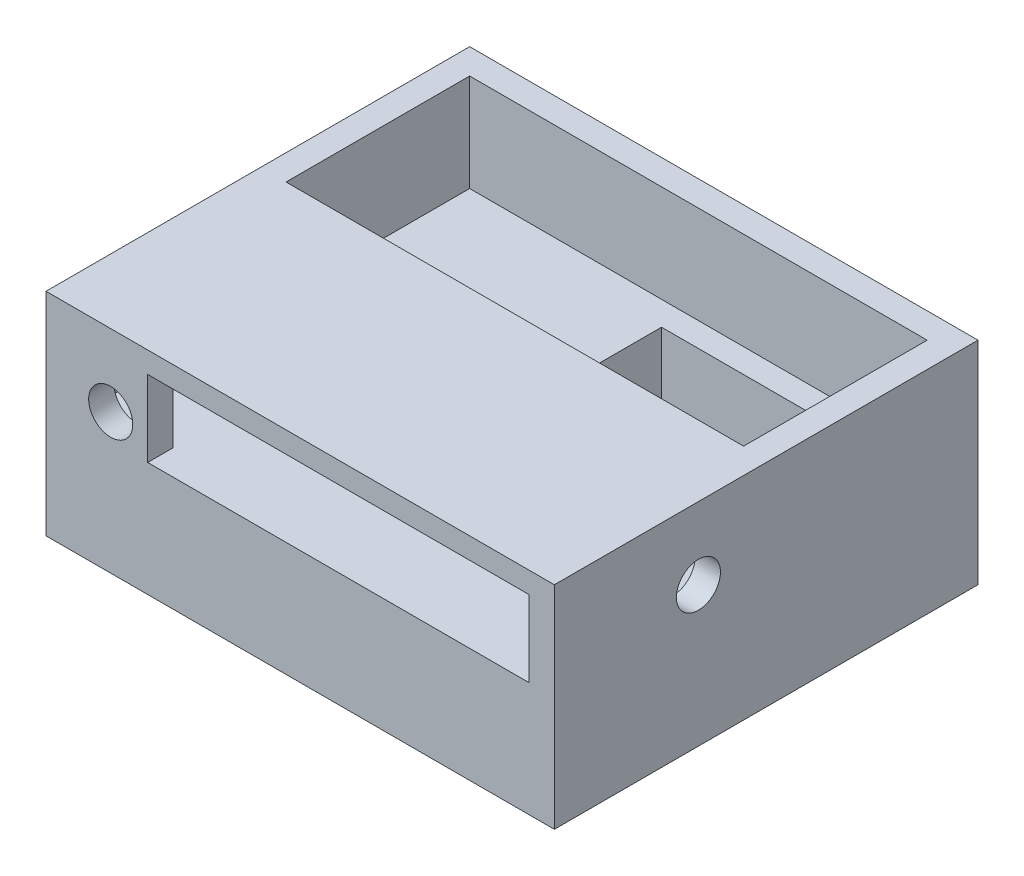
ISO-10303-21;
HEADER;
FILE_DESCRIPTION(('STEP AP214'),'2;1');
FILE_NAME('part.step','',(''),(''),'','','');
FILE_SCHEMA(('AUTOMOTIVE_DESIGN { 1 0 10303 214 1 1 1 1 }'));
ENDSEC;
DATA;
#1=APPLICATION_CONTEXT('core data for automotive mechanical design processes');
#2=APPLICATION_PROTOCOL_DEFINITION('international standard','automotive_design',2000,#1);
#3=PRODUCT_CONTEXT('',#1,'mechanical');
#4=PRODUCT('Part','Part','',(#3));
#5=PRODUCT_RELATED_PRODUCT_CATEGORY('part','',(#4));
#6=PRODUCT_DEFINITION_FORMATION('','',#4);
#7=PRODUCT_DEFINITION_CONTEXT('part definition',#1,'design');
#8=PRODUCT_DEFINITION('design','',#6,#7);
#9=PRODUCT_DEFINITION_SHAPE('','',#8);
#10=(LENGTH_UNIT() NAMED_UNIT(*) SI_UNIT(.MILLI.,.METRE.));
#11=(NAMED_UNIT(*) PLANE_ANGLE_UNIT() SI_UNIT($,.RADIAN.));
#12=(NAMED_UNIT(*) SI_UNIT($,.STERADIAN.) SOLID_ANGLE_UNIT());
#13=UNCERTAINTY_MEASURE_WITH_UNIT(LENGTH_MEASURE(1.E-05),#10,'distance_accuracy_value','');
#14=(GEOMETRIC_REPRESENTATION_CONTEXT(3) GLOBAL_UNCERTAINTY_ASSIGNED_CONTEXT((#13)) GLOBAL_UNIT_ASSIGNED_CONTEXT((#10,
#11,#12)) REPRESENTATION_CONTEXT('',''));
#15=CARTESIAN_POINT('',(0.,0.,0.));
#16=DIRECTION('',(0.,0.,1.));
#17=DIRECTION('',(1.,0.,0.));
#18=AXIS2_PLACEMENT_3D('',#15,#16,#17);
#19=CARTESIAN_POINT('',(0.,0.,0.));
#20=DIRECTION('',(0.,1.,0.));
#21=DIRECTION('',(0.,0.,1.));
#22=AXIS2_PLACEMENT_3D('',#19,#20,#21);
#23=PLANE('',#22);
#24=DIRECTION('',(0.,0.,-1.));
#25=VECTOR('',#24,1.);
#26=CARTESIAN_POINT('',(28.5,0.,5.85000000000001));
#27=LINE('',#26,#25);
#28=CARTESIAN_POINT('',(28.5,0.,18.15));
#29=VERTEX_POINT('',#28);
#30=CARTESIAN_POINT('',(28.5,0.,5.85000000000001));
#31=VERTEX_POINT('',#30);
#32=EDGE_CURVE('E572',#29,#31,#27,.T.);
#33=ORIENTED_EDGE('',*,*,#32,.F.);
#34=DIRECTION('',(-1.,0.,0.));
#35=VECTOR('',#34,1.);
#36=CARTESIAN_POINT('',(56.5,0.,18.15));
#37=LINE('',#36,#35);
#38=CARTESIAN_POINT('',(23.5,0.,18.15));
#39=VERTEX_POINT('',#38);
#40=EDGE_CURVE('E245',#29,#39,#37,.T.);
#41=ORIENTED_EDGE('',*,*,#40,.T.);
#42=DIRECTION('',(0.,0.,-1.));
#43=VECTOR('',#42,1.);
#44=CARTESIAN_POINT('',(23.5,0.,5.85000000000001));
#45=LINE('',#44,#43);
#46=CARTESIAN_POINT('',(23.5,0.,5.85000000000001));
#47=VERTEX_POINT('',#46);
#48=EDGE_CURVE('E257',#39,#47,#45,.T.);
#49=ORIENTED_EDGE('',*,*,#48,.T.);
#50=DIRECTION('',(1.,0.,0.));
#51=VECTOR('',#50,1.);
#52=CARTESIAN_POINT('',(56.5,0.,5.85000000000001));
#53=LINE('',#52,#51);
#54=EDGE_CURVE('E254',#47,#31,#53,.T.);
#55=ORIENTED_EDGE('',*,*,#54,.T.);
#56=EDGE_LOOP('',(#33,#41,#49,#55));
#57=FACE_BOUND('',#56,.T.);
#58=ADVANCED_FACE('F35',(#57),#23,.F.);
#59=CARTESIAN_POINT('',(0.,20.,0.));
#60=DIRECTION('',(1.,0.,0.));
#61=DIRECTION('',(0.,0.,-1.));
#62=AXIS2_PLACEMENT_3D('',#59,#60,#61);
#63=PLANE('',#62);
#64=DIRECTION('',(0.,-1.,0.));
#65=VECTOR('',#64,1.);
#66=CARTESIAN_POINT('',(0.,20.,50.));
#67=LINE('',#66,#65);
#68=CARTESIAN_POINT('',(0.,20.,50.));
#69=VERTEX_POINT('',#68);
#70=CARTESIAN_POINT('',(0.,-5.,50.));
#71=VERTEX_POINT('',#70);
#72=EDGE_CURVE('E233',#69,#71,#67,.T.);
#73=ORIENTED_EDGE('',*,*,#72,.F.);
#74=DIRECTION('',(0.,0.,1.));
#75=VECTOR('',#74,1.);
#76=CARTESIAN_POINT('',(0.,20.,0.));
#77=LINE('',#76,#75);
#78=CARTESIAN_POINT('',(0.,20.,0.));
#79=VERTEX_POINT('',#78);
#80=EDGE_CURVE('E215',#79,#69,#77,.T.);
#81=ORIENTED_EDGE('',*,*,#80,.F.);
#82=DIRECTION('',(0.,-1.,0.));
#83=VECTOR('',#82,1.);
#84=CARTESIAN_POINT('',(0.,20.,0.));
#85=LINE('',#84,#83);
#86=CARTESIAN_POINT('',(0.,-5.,0.));
#87=VERTEX_POINT('',#86);
#88=EDGE_CURVE('E227',#79,#87,#85,.T.);
#89=ORIENTED_EDGE('',*,*,#88,.T.);
#90=DIRECTION('',(0.,0.,-1.));
#91=VECTOR('',#90,1.);
#92=CARTESIAN_POINT('',(0.,-5.,0.));
#93=LINE('',#92,#91);
#94=EDGE_CURVE('E567',#71,#87,#93,.T.);
#95=ORIENTED_EDGE('',*,*,#94,.F.);
#96=EDGE_LOOP('',(#73,#81,#89,#95));
#97=FACE_BOUND('',#96,.T.);
#98=ADVANCED_FACE('F37',(#97),#63,.F.);
#99=CARTESIAN_POINT('',(0.,20.,50.));
#100=DIRECTION('',(0.,0.,-1.));
#101=DIRECTION('',(-1.,0.,0.));
#102=AXIS2_PLACEMENT_3D('',#99,#100,#101);
#103=PLANE('',#102);
#104=DIRECTION('',(-1.,0.,0.));
#105=VECTOR('',#104,1.);
#106=CARTESIAN_POINT('',(57.,17.5,50.));
#107=LINE('',#106,#105);
#108=CARTESIAN_POINT('',(57.,17.5,50.));
#109=VERTEX_POINT('',#108);
#110=CARTESIAN_POINT('',(12.,17.5,50.));
#111=VERTEX_POINT('',#110);
#112=EDGE_CURVE('E289',#109,#111,#107,.T.);
#113=ORIENTED_EDGE('',*,*,#112,.F.);
#114=DIRECTION('',(0.,1.,0.));
#115=VECTOR('',#114,1.);
#116=CARTESIAN_POINT('',(57.,17.5,50.));
#117=LINE('',#116,#115);
#118=CARTESIAN_POINT('',(57.,8.5,50.));
#119=VERTEX_POINT('',#118);
#120=EDGE_CURVE('E291',#119,#109,#117,.T.);
#121=ORIENTED_EDGE('',*,*,#120,.F.);
#122=DIRECTION('',(1.,0.,0.));
#123=VECTOR('',#122,1.);
#124=CARTESIAN_POINT('',(57.,8.5,50.));
#125=LINE('',#124,#123);
#126=CARTESIAN_POINT('',(12.,8.5,50.));
#127=VERTEX_POINT('',#126);
#128=EDGE_CURVE('E189',#127,#119,#125,.T.);
#129=ORIENTED_EDGE('',*,*,#128,.F.);
#130=DIRECTION('',(0.,-1.,0.));
#131=VECTOR('',#130,1.);
#132=CARTESIAN_POINT('',(12.,17.5,50.));
#133=LINE('',#132,#131);
#134=EDGE_CURVE('E173',#111,#127,#133,.T.);
#135=ORIENTED_EDGE('',*,*,#134,.F.);
#136=EDGE_LOOP('',(#113,#121,#129,#135));
#137=FACE_BOUND('',#136,.T.);
#138=CARTESIAN_POINT('',(7.63625123278189,11.4923007266441,50.));
#139=DIRECTION('',(0.,0.,1.));
#140=DIRECTION('',(1.,0.,0.));
#141=AXIS2_PLACEMENT_3D('',#138,#139,#140);
#142=CIRCLE('',#141,2.6);
#143=CARTESIAN_POINT('',(10.2362512327819,11.4923007266441,50.));
#144=VERTEX_POINT('',#143);
#145=EDGE_CURVE('E244',#144,#144,#142,.T.);
#146=ORIENTED_EDGE('',*,*,#145,.F.);
#147=EDGE_LOOP('',(#146));
#148=FACE_BOUND('',#147,.T.);
#149=DIRECTION('',(-1.,0.,0.));
#150=VECTOR('',#149,1.);
#151=CARTESIAN_POINT('',(60.,-5.,50.));
#152=LINE('',#151,#150);
#153=CARTESIAN_POINT('',(60.,-5.,50.));
#154=VERTEX_POINT('',#153);
#155=EDGE_CURVE('E609',#154,#71,#152,.T.);
#156=ORIENTED_EDGE('',*,*,#155,.F.);
#157=DIRECTION('',(0.,-1.,0.));
#158=VECTOR('',#157,1.);
#159=CARTESIAN_POINT('',(60.,20.,50.));
#160=LINE('',#159,#158);
#161=CARTESIAN_POINT('',(60.,20.,50.));
#162=VERTEX_POINT('',#161);
#163=EDGE_CURVE('E231',#162,#154,#160,.T.);
#164=ORIENTED_EDGE('',*,*,#163,.F.);
#165=DIRECTION('',(1.,0.,0.));
#166=VECTOR('',#165,1.);
#167=CARTESIAN_POINT('',(0.,20.,50.));
#168=LINE('',#167,#166);
#169=EDGE_CURVE('E221',#69,#162,#168,.T.);
#170=ORIENTED_EDGE('',*,*,#169,.F.);
#171=ORIENTED_EDGE('',*,*,#72,.T.);
#172=EDGE_LOOP('',(#156,#164,#170,#171));
#173=FACE_BOUND('',#172,.T.);
#174=ADVANCED_FACE('F298',(#137,#148,#173),#103,.F.);
#175=CARTESIAN_POINT('',(60.,20.,0.));
#176=DIRECTION('',(-1.,0.,0.));
#177=DIRECTION('',(0.,0.,1.));
#178=AXIS2_PLACEMENT_3D('',#175,#176,#177);
#179=PLANE('',#178);
#180=CARTESIAN_POINT('',(60.,11.5,33.));
#181=DIRECTION('',(1.,0.,0.));
#182=DIRECTION('',(0.,0.,-1.));
#183=AXIS2_PLACEMENT_3D('',#180,#181,#182);
#184=CIRCLE('',#183,2.6);
#185=CARTESIAN_POINT('',(60.,11.5,30.4));
#186=VERTEX_POINT('',#185);
#187=EDGE_CURVE('E240',#186,#186,#184,.T.);
#188=ORIENTED_EDGE('',*,*,#187,.F.);
#189=EDGE_LOOP('',(#188));
#190=FACE_BOUND('',#189,.T.);
#191=DIRECTION('',(0.,-1.,0.));
#192=VECTOR('',#191,1.);
#193=CARTESIAN_POINT('',(60.,20.,0.));
#194=LINE('',#193,#192);
#195=CARTESIAN_POINT('',(60.,20.,0.));
#196=VERTEX_POINT('',#195);
#197=CARTESIAN_POINT('',(60.,-5.,0.));
#198=VERTEX_POINT('',#197);
#199=EDGE_CURVE('E229',#196,#198,#194,.T.);
#200=ORIENTED_EDGE('',*,*,#199,.F.);
#201=DIRECTION('',(0.,0.,-1.));
#202=VECTOR('',#201,1.);
#203=CARTESIAN_POINT('',(60.,20.,0.));
#204=LINE('',#203,#202);
#205=EDGE_CURVE('E223',#162,#196,#204,.T.);
#206=ORIENTED_EDGE('',*,*,#205,.F.);
#207=ORIENTED_EDGE('',*,*,#163,.T.);
#208=DIRECTION('',(0.,0.,1.));
#209=VECTOR('',#208,1.);
#210=CARTESIAN_POINT('',(60.,-5.,0.));
#211=LINE('',#210,#209);
#212=EDGE_CURVE('E605',#198,#154,#211,.T.);
#213=ORIENTED_EDGE('',*,*,#212,.F.);
#214=EDGE_LOOP('',(#200,#206,#207,#213));
#215=FACE_BOUND('',#214,.T.);
#216=ADVANCED_FACE('F337',(#190,#215),#179,.F.);
#217=CARTESIAN_POINT('',(0.,20.,0.));
#218=DIRECTION('',(0.,0.,1.));
#219=DIRECTION('',(1.,0.,0.));
#220=AXIS2_PLACEMENT_3D('',#217,#218,#219);
#221=PLANE('',#220);
#222=ORIENTED_EDGE('',*,*,#199,.T.);
#223=DIRECTION('',(1.,0.,0.));
#224=VECTOR('',#223,1.);
#225=CARTESIAN_POINT('',(60.,-5.,0.));
#226=LINE('',#225,#224);
#227=EDGE_CURVE('E564',#87,#198,#226,.T.);
#228=ORIENTED_EDGE('',*,*,#227,.F.);
#229=ORIENTED_EDGE('',*,*,#88,.F.);
#230=DIRECTION('',(-1.,0.,0.));
#231=VECTOR('',#230,1.);
#232=CARTESIAN_POINT('',(0.,20.,0.));
#233=LINE('',#232,#231);
#234=EDGE_CURVE('E225',#196,#79,#233,.T.);
#235=ORIENTED_EDGE('',*,*,#234,.F.);
#236=EDGE_LOOP('',(#222,#228,#229,#235));
#237=FACE_BOUND('',#236,.T.);
#238=ADVANCED_FACE('F334',(#237),#221,.F.);
#239=CARTESIAN_POINT('',(0.,20.,0.));
#240=DIRECTION('',(0.,1.,0.));
#241=DIRECTION('',(0.,0.,1.));
#242=AXIS2_PLACEMENT_3D('',#239,#240,#241);
#243=PLANE('',#242);
#244=DIRECTION('',(0.,0.,-1.));
#245=VECTOR('',#244,1.);
#246=CARTESIAN_POINT('',(57.,20.,3.));
#247=LINE('',#246,#245);
#248=CARTESIAN_POINT('',(57.,20.,24.6679048018166));
#249=VERTEX_POINT('',#248);
#250=CARTESIAN_POINT('',(57.,20.,3.));
#251=VERTEX_POINT('',#250);
#252=EDGE_CURVE('E208',#249,#251,#247,.T.);
#253=ORIENTED_EDGE('',*,*,#252,.F.);
#254=DIRECTION('',(-1.,0.,0.));
#255=VECTOR('',#254,1.);
#256=CARTESIAN_POINT('',(0.,20.,24.6679048018166));
#257=LINE('',#256,#255);
#258=CARTESIAN_POINT('',(3.,20.,24.6679048018166));
#259=VERTEX_POINT('',#258);
#260=EDGE_CURVE('E178',#249,#259,#257,.T.);
#261=ORIENTED_EDGE('',*,*,#260,.T.);
#262=DIRECTION('',(0.,0.,1.));
#263=VECTOR('',#262,1.);
#264=CARTESIAN_POINT('',(3.,20.,3.));
#265=LINE('',#264,#263);
#266=CARTESIAN_POINT('',(3.,20.,3.));
#267=VERTEX_POINT('',#266);
#268=EDGE_CURVE('E206',#267,#259,#265,.T.);
#269=ORIENTED_EDGE('',*,*,#268,.F.);
#270=DIRECTION('',(-1.,0.,0.));
#271=VECTOR('',#270,1.);
#272=CARTESIAN_POINT('',(3.,20.,3.));
#273=LINE('',#272,#271);
#274=EDGE_CURVE('E200',#251,#267,#273,.T.);
#275=ORIENTED_EDGE('',*,*,#274,.F.);
#276=EDGE_LOOP('',(#253,#261,#269,#275));
#277=FACE_BOUND('',#276,.T.);
#278=ORIENTED_EDGE('',*,*,#205,.T.);
#279=ORIENTED_EDGE('',*,*,#234,.T.);
#280=ORIENTED_EDGE('',*,*,#80,.T.);
#281=ORIENTED_EDGE('',*,*,#169,.T.);
#282=EDGE_LOOP('',(#278,#279,#280,#281));
#283=FACE_BOUND('',#282,.T.);
#284=ADVANCED_FACE('F310',(#277,#283),#243,.T.);
#285=DIRECTION('',(0.,0.,1.));
#286=VECTOR('',#285,1.);
#287=CARTESIAN_POINT('',(56.5,0.,5.85000000000001));
#288=LINE('',#287,#286);
#289=CARTESIAN_POINT('',(56.5,0.,5.85000000000001));
#290=VERTEX_POINT('',#289);
#291=CARTESIAN_POINT('',(56.5,0.,18.15));
#292=VERTEX_POINT('',#291);
#293=EDGE_CURVE('E243',#290,#292,#288,.T.);
#294=ORIENTED_EDGE('',*,*,#293,.T.);
#295=CARTESIAN_POINT('',(51.5,0.,18.15));
#296=VERTEX_POINT('',#295);
#297=EDGE_CURVE('E248',#292,#296,#37,.T.);
#298=ORIENTED_EDGE('',*,*,#297,.T.);
#299=DIRECTION('',(0.,0.,1.));
#300=VECTOR('',#299,1.);
#301=CARTESIAN_POINT('',(51.5,0.,5.85));
#302=LINE('',#301,#300);
#303=CARTESIAN_POINT('',(51.5,0.,5.85000000000001));
#304=VERTEX_POINT('',#303);
#305=EDGE_CURVE('E239',#304,#296,#302,.T.);
#306=ORIENTED_EDGE('',*,*,#305,.F.);
#307=EDGE_CURVE('E235',#304,#290,#53,.T.);
#308=ORIENTED_EDGE('',*,*,#307,.T.);
#309=EDGE_LOOP('',(#294,#298,#306,#308));
#310=FACE_BOUND('',#309,.T.);
#311=ADVANCED_FACE('F318',(#310),#23,.F.);
#312=CARTESIAN_POINT('',(3.,8.5,3.));
#313=DIRECTION('',(-1.,0.,0.));
#314=DIRECTION('',(0.,0.,1.));
#315=AXIS2_PLACEMENT_3D('',#312,#313,#314);
#316=PLANE('',#315);
#317=ORIENTED_EDGE('',*,*,#268,.T.);
#318=DIRECTION('',(0.,-1.,0.));
#319=VECTOR('',#318,1.);
#320=CARTESIAN_POINT('',(3.,8.5,24.6679048018166));
#321=LINE('',#320,#319);
#322=CARTESIAN_POINT('',(3.,17.5,24.6679048018166));
#323=VERTEX_POINT('',#322);
#324=EDGE_CURVE('E276',#259,#323,#321,.T.);
#325=ORIENTED_EDGE('',*,*,#324,.T.);
#326=DIRECTION('',(0.,0.,1.));
#327=VECTOR('',#326,1.);
#328=CARTESIAN_POINT('',(3.,17.5,3.));
#329=LINE('',#328,#327);
#330=CARTESIAN_POINT('',(3.00000000000001,17.5,47.));
#331=VERTEX_POINT('',#330);
#332=EDGE_CURVE('E278',#323,#331,#329,.T.);
#333=ORIENTED_EDGE('',*,*,#332,.T.);
#334=DIRECTION('',(0.,1.,0.));
#335=VECTOR('',#334,1.);
#336=CARTESIAN_POINT('',(3.00000000000001,8.5,47.));
#337=LINE('',#336,#335);
#338=CARTESIAN_POINT('',(3.00000000000001,8.5,47.));
#339=VERTEX_POINT('',#338);
#340=EDGE_CURVE('E205',#339,#331,#337,.T.);
#341=ORIENTED_EDGE('',*,*,#340,.F.);
#342=DIRECTION('',(0.,0.,1.));
#343=VECTOR('',#342,1.);
#344=CARTESIAN_POINT('',(3.,8.5,3.));
#345=LINE('',#344,#343);
#346=CARTESIAN_POINT('',(3.,8.5,3.));
#347=VERTEX_POINT('',#346);
#348=EDGE_CURVE('E194',#347,#339,#345,.T.);
#349=ORIENTED_EDGE('',*,*,#348,.F.);
#350=DIRECTION('',(0.,1.,0.));
#351=VECTOR('',#350,1.);
#352=CARTESIAN_POINT('',(3.,8.5,3.));
#353=LINE('',#352,#351);
#354=EDGE_CURVE('E213',#347,#267,#353,.T.);
#355=ORIENTED_EDGE('',*,*,#354,.T.);
#356=EDGE_LOOP('',(#317,#325,#333,#341,#349,#355));
#357=FACE_BOUND('',#356,.T.);
#358=ADVANCED_FACE('F316',(#357),#316,.F.);
#359=CARTESIAN_POINT('',(3.,8.5,3.));
#360=DIRECTION('',(0.,0.,-1.));
#361=DIRECTION('',(-1.,0.,0.));
#362=AXIS2_PLACEMENT_3D('',#359,#360,#361);
#363=PLANE('',#362);
#364=ORIENTED_EDGE('',*,*,#274,.T.);
#365=ORIENTED_EDGE('',*,*,#354,.F.);
#366=DIRECTION('',(-1.,0.,0.));
#367=VECTOR('',#366,1.);
#368=CARTESIAN_POINT('',(3.,8.5,3.));
#369=LINE('',#368,#367);
#370=CARTESIAN_POINT('',(57.,8.5,3.));
#371=VERTEX_POINT('',#370);
#372=EDGE_CURVE('E198',#371,#347,#369,.T.);
#373=ORIENTED_EDGE('',*,*,#372,.F.);
#374=DIRECTION('',(0.,1.,0.));
#375=VECTOR('',#374,1.);
#376=CARTESIAN_POINT('',(57.,8.5,3.));
#377=LINE('',#376,#375);
#378=EDGE_CURVE('E216',#371,#251,#377,.T.);
#379=ORIENTED_EDGE('',*,*,#378,.T.);
#380=EDGE_LOOP('',(#364,#365,#373,#379));
#381=FACE_BOUND('',#380,.T.);
#382=ADVANCED_FACE('F314',(#381),#363,.F.);
#383=CARTESIAN_POINT('',(57.,8.5,3.));
#384=DIRECTION('',(1.,0.,0.));
#385=DIRECTION('',(0.,0.,-1.));
#386=AXIS2_PLACEMENT_3D('',#383,#384,#385);
#387=PLANE('',#386);
#388=CARTESIAN_POINT('',(57.,11.5,33.));
#389=DIRECTION('',(1.,0.,0.));
#390=DIRECTION('',(0.,0.,-1.));
#391=AXIS2_PLACEMENT_3D('',#388,#389,#390);
#392=CIRCLE('',#391,2.6);
#393=CARTESIAN_POINT('',(57.,11.5,30.4));
#394=VERTEX_POINT('',#393);
#395=EDGE_CURVE('E236',#394,#394,#392,.T.);
#396=ORIENTED_EDGE('',*,*,#395,.T.);
#397=EDGE_LOOP('',(#396));
#398=FACE_BOUND('',#397,.T.);
#399=DIRECTION('',(0.,0.,-1.));
#400=VECTOR('',#399,1.);
#401=CARTESIAN_POINT('',(57.,17.5,3.));
#402=LINE('',#401,#400);
#403=CARTESIAN_POINT('',(57.,17.5,24.6679048018166));
#404=VERTEX_POINT('',#403);
#405=EDGE_CURVE('E50',#109,#404,#402,.T.);
#406=ORIENTED_EDGE('',*,*,#405,.T.);
#407=DIRECTION('',(0.,1.,0.));
#408=VECTOR('',#407,1.);
#409=CARTESIAN_POINT('',(57.,8.5,24.6679048018166));
#410=LINE('',#409,#408);
#411=EDGE_CURVE('E11',#404,#249,#410,.T.);
#412=ORIENTED_EDGE('',*,*,#411,.T.);
#413=ORIENTED_EDGE('',*,*,#252,.T.);
#414=ORIENTED_EDGE('',*,*,#378,.F.);
#415=DIRECTION('',(0.,0.,-1.));
#416=VECTOR('',#415,1.);
#417=CARTESIAN_POINT('',(57.,8.5,3.));
#418=LINE('',#417,#416);
#419=EDGE_CURVE('E195',#119,#371,#418,.T.);
#420=ORIENTED_EDGE('',*,*,#419,.F.);
#421=ORIENTED_EDGE('',*,*,#120,.T.);
#422=EDGE_LOOP('',(#406,#412,#413,#414,#420,#421));
#423=FACE_BOUND('',#422,.T.);
#424=ADVANCED_FACE('F295',(#398,#423),#387,.F.);
#425=CARTESIAN_POINT('',(3.00000000000001,8.5,47.));
#426=DIRECTION('',(0.,0.,1.));
#427=DIRECTION('',(1.,0.,0.));
#428=AXIS2_PLACEMENT_3D('',#425,#426,#427);
#429=PLANE('',#428);
#430=CARTESIAN_POINT('',(7.63625123278189,11.4923007266441,47.));
#431=DIRECTION('',(0.,0.,1.));
#432=DIRECTION('',(1.,0.,0.));
#433=AXIS2_PLACEMENT_3D('',#430,#431,#432);
#434=CIRCLE('',#433,2.6);
#435=CARTESIAN_POINT('',(10.2362512327819,11.4923007266441,47.));
#436=VERTEX_POINT('',#435);
#437=EDGE_CURVE('E241',#436,#436,#434,.T.);
#438=ORIENTED_EDGE('',*,*,#437,.T.);
#439=EDGE_LOOP('',(#438));
#440=FACE_BOUND('',#439,.T.);
#441=DIRECTION('',(1.,0.,0.));
#442=VECTOR('',#441,1.);
#443=CARTESIAN_POINT('',(3.00000000000001,17.5,47.));
#444=LINE('',#443,#442);
#445=CARTESIAN_POINT('',(12.,17.5,47.));
#446=VERTEX_POINT('',#445);
#447=EDGE_CURVE('E43',#331,#446,#444,.T.);
#448=ORIENTED_EDGE('',*,*,#447,.T.);
#449=DIRECTION('',(0.,-1.,0.));
#450=VECTOR('',#449,1.);
#451=CARTESIAN_POINT('',(12.,17.5,47.));
#452=LINE('',#451,#450);
#453=CARTESIAN_POINT('',(12.,8.5,47.));
#454=VERTEX_POINT('',#453);
#455=EDGE_CURVE('E58',#446,#454,#452,.T.);
#456=ORIENTED_EDGE('',*,*,#455,.T.);
#457=DIRECTION('',(1.,0.,0.));
#458=VECTOR('',#457,1.);
#459=CARTESIAN_POINT('',(3.00000000000001,8.5,47.));
#460=LINE('',#459,#458);
#461=EDGE_CURVE('E186',#339,#454,#460,.T.);
#462=ORIENTED_EDGE('',*,*,#461,.F.);
#463=ORIENTED_EDGE('',*,*,#340,.T.);
#464=EDGE_LOOP('',(#448,#456,#462,#463));
#465=FACE_BOUND('',#464,.T.);
#466=ADVANCED_FACE('F184',(#440,#465),#429,.F.);
#467=CARTESIAN_POINT('',(0.,8.5,0.));
#468=DIRECTION('',(0.,1.,0.));
#469=DIRECTION('',(0.,0.,1.));
#470=AXIS2_PLACEMENT_3D('',#467,#468,#469);
#471=PLANE('',#470);
#472=DIRECTION('',(0.,0.,1.));
#473=VECTOR('',#472,1.);
#474=CARTESIAN_POINT('',(28.5,8.5,5.85000000000001));
#475=LINE('',#474,#473);
#476=CARTESIAN_POINT('',(28.5,8.5,5.85000000000001));
#477=VERTEX_POINT('',#476);
#478=CARTESIAN_POINT('',(28.5,8.5,18.15));
#479=VERTEX_POINT('',#478);
#480=EDGE_CURVE('E575',#477,#479,#475,.T.);
#481=ORIENTED_EDGE('',*,*,#480,.F.);
#482=DIRECTION('',(-1.,0.,0.));
#483=VECTOR('',#482,1.);
#484=CARTESIAN_POINT('',(28.5,8.5,5.85000000000001));
#485=LINE('',#484,#483);
#486=CARTESIAN_POINT('',(51.5,8.5,5.85));
#487=VERTEX_POINT('',#486);
#488=EDGE_CURVE('E583',#487,#477,#485,.T.);
#489=ORIENTED_EDGE('',*,*,#488,.F.);
#490=DIRECTION('',(0.,0.,-1.));
#491=VECTOR('',#490,1.);
#492=CARTESIAN_POINT('',(51.5,8.5,5.85));
#493=LINE('',#492,#491);
#494=CARTESIAN_POINT('',(51.5,8.5,18.15));
#495=VERTEX_POINT('',#494);
#496=EDGE_CURVE('E580',#495,#487,#493,.T.);
#497=ORIENTED_EDGE('',*,*,#496,.F.);
#498=DIRECTION('',(1.,0.,0.));
#499=VECTOR('',#498,1.);
#500=CARTESIAN_POINT('',(28.5,8.5,18.15));
#501=LINE('',#500,#499);
#502=EDGE_CURVE('E577',#479,#495,#501,.T.);
#503=ORIENTED_EDGE('',*,*,#502,.F.);
#504=EDGE_LOOP('',(#481,#489,#497,#503));
#505=FACE_BOUND('',#504,.T.);
#506=ORIENTED_EDGE('',*,*,#348,.T.);
#507=ORIENTED_EDGE('',*,*,#461,.T.);
#508=DIRECTION('',(0.,0.,1.));
#509=VECTOR('',#508,1.);
#510=CARTESIAN_POINT('',(12.,8.5,47.));
#511=LINE('',#510,#509);
#512=EDGE_CURVE('E170',#454,#127,#511,.T.);
#513=ORIENTED_EDGE('',*,*,#512,.T.);
#514=ORIENTED_EDGE('',*,*,#128,.T.);
#515=ORIENTED_EDGE('',*,*,#419,.T.);
#516=ORIENTED_EDGE('',*,*,#372,.T.);
#517=EDGE_LOOP('',(#506,#507,#513,#514,#515,#516));
#518=FACE_BOUND('',#517,.T.);
#519=ADVANCED_FACE('F191',(#505,#518),#471,.T.);
#520=CARTESIAN_POINT('',(28.5,-0.000999999999999265,5.85000000000001));
#521=DIRECTION('',(-1.,0.,0.));
#522=DIRECTION('',(0.,0.,1.));
#523=AXIS2_PLACEMENT_3D('',#520,#521,#522);
#524=PLANE('',#523);
#525=ORIENTED_EDGE('',*,*,#32,.T.);
#526=DIRECTION('',(0.,1.,0.));
#527=VECTOR('',#526,1.);
#528=CARTESIAN_POINT('',(28.5,-0.000999999999999265,5.85000000000001));
#529=LINE('',#528,#527);
#530=EDGE_CURVE('E209',#31,#477,#529,.T.);
#531=ORIENTED_EDGE('',*,*,#530,.T.);
#532=ORIENTED_EDGE('',*,*,#480,.T.);
#533=DIRECTION('',(0.,1.,0.));
#534=VECTOR('',#533,1.);
#535=CARTESIAN_POINT('',(28.5,-0.000999999999999265,18.15));
#536=LINE('',#535,#534);
#537=EDGE_CURVE('E586',#29,#479,#536,.T.);
#538=ORIENTED_EDGE('',*,*,#537,.F.);
#539=EDGE_LOOP('',(#525,#531,#532,#538));
#540=FACE_BOUND('',#539,.T.);
#541=ADVANCED_FACE('F372',(#540),#524,.F.);
#542=CARTESIAN_POINT('',(28.5,-0.000999999999999265,5.85000000000001));
#543=DIRECTION('',(0.,0.,-1.));
#544=DIRECTION('',(-1.,0.,0.));
#545=AXIS2_PLACEMENT_3D('',#542,#543,#544);
#546=PLANE('',#545);
#547=ORIENTED_EDGE('',*,*,#530,.F.);
#548=ORIENTED_EDGE('',*,*,#54,.F.);
#549=DIRECTION('',(0.,1.,0.));
#550=VECTOR('',#549,1.);
#551=CARTESIAN_POINT('',(23.5,-5.,5.85000000000001));
#552=LINE('',#551,#550);
#553=CARTESIAN_POINT('',(23.5,-5.,5.85000000000001));
#554=VERTEX_POINT('',#553);
#555=EDGE_CURVE('E611',#554,#47,#552,.T.);
#556=ORIENTED_EDGE('',*,*,#555,.F.);
#557=DIRECTION('',(1.,0.,0.));
#558=VECTOR('',#557,1.);
#559=CARTESIAN_POINT('',(56.5,-5.,5.85000000000001));
#560=LINE('',#559,#558);
#561=CARTESIAN_POINT('',(56.5,-5.,5.85000000000001));
#562=VERTEX_POINT('',#561);
#563=EDGE_CURVE('E264',#554,#562,#560,.T.);
#564=ORIENTED_EDGE('',*,*,#563,.T.);
#565=DIRECTION('',(0.,1.,0.));
#566=VECTOR('',#565,1.);
#567=CARTESIAN_POINT('',(56.5,-5.,5.85000000000001));
#568=LINE('',#567,#566);
#569=EDGE_CURVE('E266',#562,#290,#568,.T.);
#570=ORIENTED_EDGE('',*,*,#569,.T.);
#571=ORIENTED_EDGE('',*,*,#307,.F.);
#572=DIRECTION('',(0.,1.,0.));
#573=VECTOR('',#572,1.);
#574=CARTESIAN_POINT('',(51.5,-0.000999999999999265,5.85));
#575=LINE('',#574,#573);
#576=EDGE_CURVE('E588',#304,#487,#575,.T.);
#577=ORIENTED_EDGE('',*,*,#576,.T.);
#578=ORIENTED_EDGE('',*,*,#488,.T.);
#579=EDGE_LOOP('',(#547,#548,#556,#564,#570,#571,#577,#578));
#580=FACE_BOUND('',#579,.T.);
#581=ADVANCED_FACE('F377',(#580),#546,.F.);
#582=CARTESIAN_POINT('',(51.5,-0.000999999999999265,5.85));
#583=DIRECTION('',(1.,0.,0.));
#584=DIRECTION('',(0.,0.,-1.));
#585=AXIS2_PLACEMENT_3D('',#582,#583,#584);
#586=PLANE('',#585);
#587=ORIENTED_EDGE('',*,*,#305,.T.);
#588=DIRECTION('',(0.,1.,0.));
#589=VECTOR('',#588,1.);
#590=CARTESIAN_POINT('',(51.5,-0.000999999999999265,18.15));
#591=LINE('',#590,#589);
#592=EDGE_CURVE('E590',#296,#495,#591,.T.);
#593=ORIENTED_EDGE('',*,*,#592,.T.);
#594=ORIENTED_EDGE('',*,*,#496,.T.);
#595=ORIENTED_EDGE('',*,*,#576,.F.);
#596=EDGE_LOOP('',(#587,#593,#594,#595));
#597=FACE_BOUND('',#596,.T.);
#598=ADVANCED_FACE('F390',(#597),#586,.F.);
#599=CARTESIAN_POINT('',(28.5,-0.000999999999999265,18.15));
#600=DIRECTION('',(0.,0.,1.));
#601=DIRECTION('',(1.,0.,0.));
#602=AXIS2_PLACEMENT_3D('',#599,#600,#601);
#603=PLANE('',#602);
#604=ORIENTED_EDGE('',*,*,#592,.F.);
#605=ORIENTED_EDGE('',*,*,#297,.F.);
#606=DIRECTION('',(0.,1.,0.));
#607=VECTOR('',#606,1.);
#608=CARTESIAN_POINT('',(56.5,-5.,18.15));
#609=LINE('',#608,#607);
#610=CARTESIAN_POINT('',(56.5,-5.,18.15));
#611=VERTEX_POINT('',#610);
#612=EDGE_CURVE('E601',#611,#292,#609,.T.);
#613=ORIENTED_EDGE('',*,*,#612,.F.);
#614=DIRECTION('',(-1.,0.,0.));
#615=VECTOR('',#614,1.);
#616=CARTESIAN_POINT('',(56.5,-5.,18.15));
#617=LINE('',#616,#615);
#618=CARTESIAN_POINT('',(23.5,-5.,18.15));
#619=VERTEX_POINT('',#618);
#620=EDGE_CURVE('E270',#611,#619,#617,.T.);
#621=ORIENTED_EDGE('',*,*,#620,.T.);
#622=DIRECTION('',(0.,1.,0.));
#623=VECTOR('',#622,1.);
#624=CARTESIAN_POINT('',(23.5,-5.,18.15));
#625=LINE('',#624,#623);
#626=EDGE_CURVE('E606',#619,#39,#625,.T.);
#627=ORIENTED_EDGE('',*,*,#626,.T.);
#628=ORIENTED_EDGE('',*,*,#40,.F.);
#629=ORIENTED_EDGE('',*,*,#537,.T.);
#630=ORIENTED_EDGE('',*,*,#502,.T.);
#631=EDGE_LOOP('',(#604,#605,#613,#621,#627,#628,#629,#630));
#632=FACE_BOUND('',#631,.T.);
#633=ADVANCED_FACE('F401',(#632),#603,.F.);
#634=CARTESIAN_POINT('',(50.,11.5,33.));
#635=DIRECTION('',(1.,0.,0.));
#636=DIRECTION('',(0.,0.,-1.));
#637=AXIS2_PLACEMENT_3D('',#634,#635,#636);
#638=CYLINDRICAL_SURFACE('',#637,2.6);
#639=ORIENTED_EDGE('',*,*,#187,.T.);
#640=EDGE_LOOP('',(#639));
#641=FACE_BOUND('',#640,.T.);
#642=ORIENTED_EDGE('',*,*,#395,.F.);
#643=EDGE_LOOP('',(#642));
#644=FACE_BOUND('',#643,.T.);
#645=ADVANCED_FACE('F411',(#641,#644),#638,.F.);
#646=CARTESIAN_POINT('',(0.,-5.,0.));
#647=DIRECTION('',(0.,-1.,0.));
#648=DIRECTION('',(0.,0.,-1.));
#649=AXIS2_PLACEMENT_3D('',#646,#647,#648);
#650=PLANE('',#649);
#651=ORIENTED_EDGE('',*,*,#212,.T.);
#652=ORIENTED_EDGE('',*,*,#155,.T.);
#653=ORIENTED_EDGE('',*,*,#94,.T.);
#654=ORIENTED_EDGE('',*,*,#227,.T.);
#655=EDGE_LOOP('',(#651,#652,#653,#654));
#656=FACE_BOUND('',#655,.T.);
#657=ORIENTED_EDGE('',*,*,#620,.F.);
#658=DIRECTION('',(0.,0.,1.));
#659=VECTOR('',#658,1.);
#660=CARTESIAN_POINT('',(56.5,-5.,5.85000000000001));
#661=LINE('',#660,#659);
#662=EDGE_CURVE('E272',#562,#611,#661,.T.);
#663=ORIENTED_EDGE('',*,*,#662,.F.);
#664=ORIENTED_EDGE('',*,*,#563,.F.);
#665=DIRECTION('',(0.,0.,-1.));
#666=VECTOR('',#665,1.);
#667=CARTESIAN_POINT('',(23.5,-5.,5.85000000000001));
#668=LINE('',#667,#666);
#669=EDGE_CURVE('E267',#619,#554,#668,.T.);
#670=ORIENTED_EDGE('',*,*,#669,.F.);
#671=EDGE_LOOP('',(#657,#663,#664,#670));
#672=FACE_BOUND('',#671,.T.);
#673=ADVANCED_FACE('F419',(#656,#672),#650,.T.);
#674=CARTESIAN_POINT('',(56.5,-5.,5.85000000000001));
#675=DIRECTION('',(-1.,0.,0.));
#676=DIRECTION('',(0.,0.,1.));
#677=AXIS2_PLACEMENT_3D('',#674,#675,#676);
#678=PLANE('',#677);
#679=ORIENTED_EDGE('',*,*,#293,.F.);
#680=ORIENTED_EDGE('',*,*,#569,.F.);
#681=ORIENTED_EDGE('',*,*,#662,.T.);
#682=ORIENTED_EDGE('',*,*,#612,.T.);
#683=EDGE_LOOP('',(#679,#680,#681,#682));
#684=FACE_BOUND('',#683,.T.);
#685=ADVANCED_FACE('F423',(#684),#678,.T.);
#686=CARTESIAN_POINT('',(23.5,-5.,5.85000000000001));
#687=DIRECTION('',(1.,0.,0.));
#688=DIRECTION('',(0.,0.,-1.));
#689=AXIS2_PLACEMENT_3D('',#686,#687,#688);
#690=PLANE('',#689);
#691=ORIENTED_EDGE('',*,*,#48,.F.);
#692=ORIENTED_EDGE('',*,*,#626,.F.);
#693=ORIENTED_EDGE('',*,*,#669,.T.);
#694=ORIENTED_EDGE('',*,*,#555,.T.);
#695=EDGE_LOOP('',(#691,#692,#693,#694));
#696=FACE_BOUND('',#695,.T.);
#697=ADVANCED_FACE('F433',(#696),#690,.T.);
#698=CARTESIAN_POINT('',(7.63625123278189,11.4923007266441,40.));
#699=DIRECTION('',(0.,0.,1.));
#700=DIRECTION('',(1.,0.,0.));
#701=AXIS2_PLACEMENT_3D('',#698,#699,#700);
#702=CYLINDRICAL_SURFACE('',#701,2.6);
#703=ORIENTED_EDGE('',*,*,#145,.T.);
#704=EDGE_LOOP('',(#703));
#705=FACE_BOUND('',#704,.T.);
#706=ORIENTED_EDGE('',*,*,#437,.F.);
#707=EDGE_LOOP('',(#706));
#708=FACE_BOUND('',#707,.T.);
#709=ADVANCED_FACE('F443',(#705,#708),#702,.F.);
#710=CARTESIAN_POINT('',(0.,17.5,24.6679048018166));
#711=DIRECTION('',(0.,0.,-1.));
#712=DIRECTION('',(-1.,0.,0.));
#713=AXIS2_PLACEMENT_3D('',#710,#711,#712);
#714=PLANE('',#713);
#715=ORIENTED_EDGE('',*,*,#324,.F.);
#716=ORIENTED_EDGE('',*,*,#260,.F.);
#717=ORIENTED_EDGE('',*,*,#411,.F.);
#718=DIRECTION('',(-1.,0.,0.));
#719=VECTOR('',#718,1.);
#720=CARTESIAN_POINT('',(0.,17.5,24.6679048018166));
#721=LINE('',#720,#719);
#722=EDGE_CURVE('E281',#404,#323,#721,.T.);
#723=ORIENTED_EDGE('',*,*,#722,.T.);
#724=EDGE_LOOP('',(#715,#716,#717,#723));
#725=FACE_BOUND('',#724,.T.);
#726=ADVANCED_FACE('F305',(#725),#714,.T.);
#727=CARTESIAN_POINT('',(0.,17.5,0.));
#728=DIRECTION('',(0.,-1.,0.));
#729=DIRECTION('',(0.,0.,-1.));
#730=AXIS2_PLACEMENT_3D('',#727,#728,#729);
#731=PLANE('',#730);
#732=ORIENTED_EDGE('',*,*,#332,.F.);
#733=ORIENTED_EDGE('',*,*,#722,.F.);
#734=ORIENTED_EDGE('',*,*,#405,.F.);
#735=ORIENTED_EDGE('',*,*,#112,.T.);
#736=DIRECTION('',(0.,0.,1.));
#737=VECTOR('',#736,1.);
#738=CARTESIAN_POINT('',(12.,17.5,47.));
#739=LINE('',#738,#737);
#740=EDGE_CURVE('E179',#446,#111,#739,.T.);
#741=ORIENTED_EDGE('',*,*,#740,.F.);
#742=ORIENTED_EDGE('',*,*,#447,.F.);
#743=EDGE_LOOP('',(#732,#733,#734,#735,#741,#742));
#744=FACE_BOUND('',#743,.T.);
#745=ADVANCED_FACE('F301',(#744),#731,.T.);
#746=CARTESIAN_POINT('',(12.,17.5,47.));
#747=DIRECTION('',(-1.,0.,0.));
#748=DIRECTION('',(0.,0.,1.));
#749=AXIS2_PLACEMENT_3D('',#746,#747,#748);
#750=PLANE('',#749);
#751=ORIENTED_EDGE('',*,*,#134,.T.);
#752=ORIENTED_EDGE('',*,*,#512,.F.);
#753=ORIENTED_EDGE('',*,*,#455,.F.);
#754=ORIENTED_EDGE('',*,*,#740,.T.);
#755=EDGE_LOOP('',(#751,#752,#753,#754));
#756=FACE_BOUND('',#755,.T.);
#757=ADVANCED_FACE('F171',(#756),#750,.F.);
#758=CLOSED_SHELL('',(#58,#98,#174,#216,#238,#284,#311,#358,#382,#424,#466,#519,#541,#581,#598,
#633,#645,#673,#685,#697,#709,#726,#745,#757));
#759=MANIFOLD_SOLID_BREP('B2',#758);
#760=ADVANCED_BREP_SHAPE_REPRESENTATION('',(#18,#759),#14);
#761=SHAPE_DEFINITION_REPRESENTATION(#9,#760);
ENDSEC;
END-ISO-10303-21;
